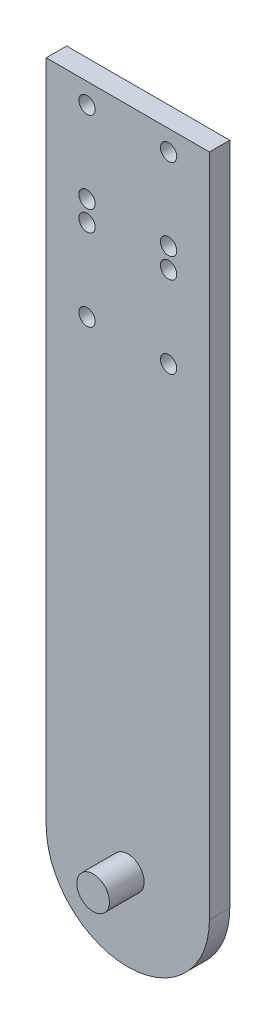
ISO-10303-21;
HEADER;
FILE_DESCRIPTION(('STEP AP214'),'2;1');
FILE_NAME('part.step','',(''),(''),'','','');
FILE_SCHEMA(('AUTOMOTIVE_DESIGN { 1 0 10303 214 1 1 1 1 }'));
ENDSEC;
DATA;
#1=APPLICATION_CONTEXT('core data for automotive mechanical design processes');
#2=APPLICATION_PROTOCOL_DEFINITION('international standard','automotive_design',2000,#1);
#3=PRODUCT_CONTEXT('',#1,'mechanical');
#4=PRODUCT('Part','Part','',(#3));
#5=PRODUCT_RELATED_PRODUCT_CATEGORY('part','',(#4));
#6=PRODUCT_DEFINITION_FORMATION('','',#4);
#7=PRODUCT_DEFINITION_CONTEXT('part definition',#1,'design');
#8=PRODUCT_DEFINITION('design','',#6,#7);
#9=PRODUCT_DEFINITION_SHAPE('','',#8);
#10=(LENGTH_UNIT() NAMED_UNIT(*) SI_UNIT(.MILLI.,.METRE.));
#11=(NAMED_UNIT(*) PLANE_ANGLE_UNIT() SI_UNIT($,.RADIAN.));
#12=(NAMED_UNIT(*) SI_UNIT($,.STERADIAN.) SOLID_ANGLE_UNIT());
#13=UNCERTAINTY_MEASURE_WITH_UNIT(LENGTH_MEASURE(1.E-05),#10,'distance_accuracy_value','');
#14=(GEOMETRIC_REPRESENTATION_CONTEXT(3) GLOBAL_UNCERTAINTY_ASSIGNED_CONTEXT((#13)) GLOBAL_UNIT_ASSIGNED_CONTEXT((#10,
#11,#12)) REPRESENTATION_CONTEXT('',''));
#15=CARTESIAN_POINT('',(0.,0.,0.));
#16=DIRECTION('',(0.,0.,1.));
#17=DIRECTION('',(1.,0.,0.));
#18=AXIS2_PLACEMENT_3D('',#15,#16,#17);
#19=CARTESIAN_POINT('',(-20.,0.,5.));
#20=DIRECTION('',(0.,0.,-1.));
#21=DIRECTION('',(-1.,0.,0.));
#22=AXIS2_PLACEMENT_3D('',#19,#20,#21);
#23=CYLINDRICAL_SURFACE('',#22,20.);
#24=CARTESIAN_POINT('',(-20.,0.,0.));
#25=DIRECTION('',(0.,0.,1.));
#26=DIRECTION('',(1.,0.,0.));
#27=AXIS2_PLACEMENT_3D('',#24,#25,#26);
#28=CIRCLE('',#27,20.);
#29=CARTESIAN_POINT('',(-40.,0.,0.));
#30=VERTEX_POINT('',#29);
#31=CARTESIAN_POINT('',(0.,0.,0.));
#32=VERTEX_POINT('',#31);
#33=EDGE_CURVE('E104',#30,#32,#28,.T.);
#34=ORIENTED_EDGE('',*,*,#33,.T.);
#35=DIRECTION('',(0.,0.,-1.));
#36=VECTOR('',#35,1.);
#37=CARTESIAN_POINT('',(0.,0.,5.));
#38=LINE('',#37,#36);
#39=CARTESIAN_POINT('',(0.,0.,5.));
#40=VERTEX_POINT('',#39);
#41=EDGE_CURVE('E11',#40,#32,#38,.T.);
#42=ORIENTED_EDGE('',*,*,#41,.F.);
#43=CARTESIAN_POINT('',(-20.,0.,5.));
#44=DIRECTION('',(0.,0.,1.));
#45=DIRECTION('',(1.,0.,0.));
#46=AXIS2_PLACEMENT_3D('',#43,#44,#45);
#47=CIRCLE('',#46,20.);
#48=CARTESIAN_POINT('',(-40.,0.,5.));
#49=VERTEX_POINT('',#48);
#50=EDGE_CURVE('E91',#49,#40,#47,.T.);
#51=ORIENTED_EDGE('',*,*,#50,.F.);
#52=DIRECTION('',(0.,0.,-1.));
#53=VECTOR('',#52,1.);
#54=CARTESIAN_POINT('',(-40.,0.,5.));
#55=LINE('',#54,#53);
#56=EDGE_CURVE('E100',#49,#30,#55,.T.);
#57=ORIENTED_EDGE('',*,*,#56,.T.);
#58=EDGE_LOOP('',(#34,#42,#51,#57));
#59=FACE_BOUND('',#58,.T.);
#60=ADVANCED_FACE('F38',(#59),#23,.T.);
#61=CARTESIAN_POINT('',(0.,0.,5.));
#62=DIRECTION('',(-1.,0.,0.));
#63=DIRECTION('',(0.,0.,1.));
#64=AXIS2_PLACEMENT_3D('',#61,#62,#63);
#65=PLANE('',#64);
#66=DIRECTION('',(0.,1.,0.));
#67=VECTOR('',#66,1.);
#68=CARTESIAN_POINT('',(0.,0.,0.));
#69=LINE('',#68,#67);
#70=CARTESIAN_POINT('',(0.,163.,0.));
#71=VERTEX_POINT('',#70);
#72=EDGE_CURVE('E95',#32,#71,#69,.T.);
#73=ORIENTED_EDGE('',*,*,#72,.T.);
#74=DIRECTION('',(0.,0.,-1.));
#75=VECTOR('',#74,1.);
#76=CARTESIAN_POINT('',(0.,163.,5.));
#77=LINE('',#76,#75);
#78=CARTESIAN_POINT('',(0.,163.,5.));
#79=VERTEX_POINT('',#78);
#80=EDGE_CURVE('E47',#79,#71,#77,.T.);
#81=ORIENTED_EDGE('',*,*,#80,.F.);
#82=DIRECTION('',(0.,1.,0.));
#83=VECTOR('',#82,1.);
#84=CARTESIAN_POINT('',(0.,0.,5.));
#85=LINE('',#84,#83);
#86=EDGE_CURVE('E86',#40,#79,#85,.T.);
#87=ORIENTED_EDGE('',*,*,#86,.F.);
#88=ORIENTED_EDGE('',*,*,#41,.T.);
#89=EDGE_LOOP('',(#73,#81,#87,#88));
#90=FACE_BOUND('',#89,.T.);
#91=ADVANCED_FACE('F94',(#90),#65,.F.);
#92=CARTESIAN_POINT('',(-40.,163.,5.));
#93=DIRECTION('',(0.,-1.,0.));
#94=DIRECTION('',(0.,0.,-1.));
#95=AXIS2_PLACEMENT_3D('',#92,#93,#94);
#96=PLANE('',#95);
#97=DIRECTION('',(-1.,0.,0.));
#98=VECTOR('',#97,1.);
#99=CARTESIAN_POINT('',(-40.,163.,0.));
#100=LINE('',#99,#98);
#101=CARTESIAN_POINT('',(-40.,163.,0.));
#102=VERTEX_POINT('',#101);
#103=EDGE_CURVE('E73',#71,#102,#100,.T.);
#104=ORIENTED_EDGE('',*,*,#103,.T.);
#105=DIRECTION('',(0.,0.,-1.));
#106=VECTOR('',#105,1.);
#107=CARTESIAN_POINT('',(-40.,163.,5.));
#108=LINE('',#107,#106);
#109=CARTESIAN_POINT('',(-40.,163.,5.));
#110=VERTEX_POINT('',#109);
#111=EDGE_CURVE('E96',#110,#102,#108,.T.);
#112=ORIENTED_EDGE('',*,*,#111,.F.);
#113=DIRECTION('',(-1.,0.,0.));
#114=VECTOR('',#113,1.);
#115=CARTESIAN_POINT('',(-40.,163.,5.));
#116=LINE('',#115,#114);
#117=EDGE_CURVE('E89',#79,#110,#116,.T.);
#118=ORIENTED_EDGE('',*,*,#117,.F.);
#119=ORIENTED_EDGE('',*,*,#80,.T.);
#120=EDGE_LOOP('',(#104,#112,#118,#119));
#121=FACE_BOUND('',#120,.T.);
#122=ADVANCED_FACE('F98',(#121),#96,.F.);
#123=CARTESIAN_POINT('',(-40.,0.,5.));
#124=DIRECTION('',(1.,0.,0.));
#125=DIRECTION('',(0.,0.,-1.));
#126=AXIS2_PLACEMENT_3D('',#123,#124,#125);
#127=PLANE('',#126);
#128=DIRECTION('',(0.,-1.,0.));
#129=VECTOR('',#128,1.);
#130=CARTESIAN_POINT('',(-40.,0.,0.));
#131=LINE('',#130,#129);
#132=EDGE_CURVE('E79',#102,#30,#131,.T.);
#133=ORIENTED_EDGE('',*,*,#132,.T.);
#134=ORIENTED_EDGE('',*,*,#56,.F.);
#135=DIRECTION('',(0.,-1.,0.));
#136=VECTOR('',#135,1.);
#137=CARTESIAN_POINT('',(-40.,0.,5.));
#138=LINE('',#137,#136);
#139=EDGE_CURVE('E56',#110,#49,#138,.T.);
#140=ORIENTED_EDGE('',*,*,#139,.F.);
#141=ORIENTED_EDGE('',*,*,#111,.T.);
#142=EDGE_LOOP('',(#133,#134,#140,#141));
#143=FACE_BOUND('',#142,.T.);
#144=ADVANCED_FACE('F163',(#143),#127,.F.);
#145=CARTESIAN_POINT('',(-20.,0.,5.));
#146=DIRECTION('',(0.,0.,1.));
#147=DIRECTION('',(1.,0.,0.));
#148=AXIS2_PLACEMENT_3D('',#145,#146,#147);
#149=PLANE('',#148);
#150=CARTESIAN_POINT('',(-10.,113.,5.));
#151=DIRECTION('',(0.,0.,1.));
#152=DIRECTION('',(1.,0.,0.));
#153=AXIS2_PLACEMENT_3D('',#150,#151,#152);
#154=CIRCLE('',#153,2.);
#155=CARTESIAN_POINT('',(-8.,113.,5.));
#156=VERTEX_POINT('',#155);
#157=EDGE_CURVE('E306',#156,#156,#154,.T.);
#158=ORIENTED_EDGE('',*,*,#157,.F.);
#159=EDGE_LOOP('',(#158));
#160=FACE_BOUND('',#159,.T.);
#161=CARTESIAN_POINT('',(-30.,113.,5.));
#162=DIRECTION('',(0.,0.,1.));
#163=DIRECTION('',(1.,0.,0.));
#164=AXIS2_PLACEMENT_3D('',#161,#162,#163);
#165=CIRCLE('',#164,2.);
#166=CARTESIAN_POINT('',(-28.,113.,5.));
#167=VERTEX_POINT('',#166);
#168=EDGE_CURVE('E310',#167,#167,#165,.T.);
#169=ORIENTED_EDGE('',*,*,#168,.F.);
#170=EDGE_LOOP('',(#169));
#171=FACE_BOUND('',#170,.T.);
#172=CARTESIAN_POINT('',(-30.,138.,5.));
#173=DIRECTION('',(0.,0.,1.));
#174=DIRECTION('',(1.,0.,0.));
#175=AXIS2_PLACEMENT_3D('',#172,#173,#174);
#176=CIRCLE('',#175,2.);
#177=CARTESIAN_POINT('',(-28.,138.,5.));
#178=VERTEX_POINT('',#177);
#179=EDGE_CURVE('E130',#178,#178,#176,.T.);
#180=ORIENTED_EDGE('',*,*,#179,.F.);
#181=EDGE_LOOP('',(#180));
#182=FACE_BOUND('',#181,.T.);
#183=CARTESIAN_POINT('',(-10.,138.,5.));
#184=DIRECTION('',(0.,0.,1.));
#185=DIRECTION('',(1.,0.,0.));
#186=AXIS2_PLACEMENT_3D('',#183,#184,#185);
#187=CIRCLE('',#186,2.);
#188=CARTESIAN_POINT('',(-8.,138.,5.));
#189=VERTEX_POINT('',#188);
#190=EDGE_CURVE('E136',#189,#189,#187,.T.);
#191=ORIENTED_EDGE('',*,*,#190,.F.);
#192=EDGE_LOOP('',(#191));
#193=FACE_BOUND('',#192,.T.);
#194=CARTESIAN_POINT('',(-30.,133.,5.));
#195=DIRECTION('',(0.,0.,1.));
#196=DIRECTION('',(1.,0.,0.));
#197=AXIS2_PLACEMENT_3D('',#194,#195,#196);
#198=CIRCLE('',#197,2.);
#199=CARTESIAN_POINT('',(-28.,133.,5.));
#200=VERTEX_POINT('',#199);
#201=EDGE_CURVE('E125',#200,#200,#198,.T.);
#202=ORIENTED_EDGE('',*,*,#201,.F.);
#203=EDGE_LOOP('',(#202));
#204=FACE_BOUND('',#203,.T.);
#205=CARTESIAN_POINT('',(-10.,133.,5.));
#206=DIRECTION('',(0.,0.,1.));
#207=DIRECTION('',(1.,0.,0.));
#208=AXIS2_PLACEMENT_3D('',#205,#206,#207);
#209=CIRCLE('',#208,2.);
#210=CARTESIAN_POINT('',(-8.,133.,5.));
#211=VERTEX_POINT('',#210);
#212=EDGE_CURVE('E134',#211,#211,#209,.T.);
#213=ORIENTED_EDGE('',*,*,#212,.F.);
#214=EDGE_LOOP('',(#213));
#215=FACE_BOUND('',#214,.T.);
#216=CARTESIAN_POINT('',(-30.,158.,5.));
#217=DIRECTION('',(0.,0.,1.));
#218=DIRECTION('',(1.,0.,0.));
#219=AXIS2_PLACEMENT_3D('',#216,#217,#218);
#220=CIRCLE('',#219,2.);
#221=CARTESIAN_POINT('',(-28.,158.,5.));
#222=VERTEX_POINT('',#221);
#223=EDGE_CURVE('E117',#222,#222,#220,.T.);
#224=ORIENTED_EDGE('',*,*,#223,.F.);
#225=EDGE_LOOP('',(#224));
#226=FACE_BOUND('',#225,.T.);
#227=CARTESIAN_POINT('',(-10.,158.,5.));
#228=DIRECTION('',(0.,0.,1.));
#229=DIRECTION('',(1.,0.,0.));
#230=AXIS2_PLACEMENT_3D('',#227,#228,#229);
#231=CIRCLE('',#230,2.);
#232=CARTESIAN_POINT('',(-8.,158.,5.));
#233=VERTEX_POINT('',#232);
#234=EDGE_CURVE('E127',#233,#233,#231,.T.);
#235=ORIENTED_EDGE('',*,*,#234,.F.);
#236=EDGE_LOOP('',(#235));
#237=FACE_BOUND('',#236,.T.);
#238=CARTESIAN_POINT('',(-20.,0.,5.));
#239=DIRECTION('',(0.,0.,1.));
#240=DIRECTION('',(1.,0.,0.));
#241=AXIS2_PLACEMENT_3D('',#238,#239,#240);
#242=CIRCLE('',#241,4.);
#243=CARTESIAN_POINT('',(-16.,0.,5.));
#244=VERTEX_POINT('',#243);
#245=EDGE_CURVE('E120',#244,#244,#242,.T.);
#246=ORIENTED_EDGE('',*,*,#245,.F.);
#247=EDGE_LOOP('',(#246));
#248=FACE_BOUND('',#247,.T.);
#249=ORIENTED_EDGE('',*,*,#50,.T.);
#250=ORIENTED_EDGE('',*,*,#86,.T.);
#251=ORIENTED_EDGE('',*,*,#117,.T.);
#252=ORIENTED_EDGE('',*,*,#139,.T.);
#253=EDGE_LOOP('',(#249,#250,#251,#252));
#254=FACE_BOUND('',#253,.T.);
#255=ADVANCED_FACE('F87',(#160,#171,#182,#193,#204,#215,#226,#237,#248,#254),#149,.T.);
#256=CARTESIAN_POINT('',(-20.,0.,0.));
#257=DIRECTION('',(0.,0.,1.));
#258=DIRECTION('',(1.,0.,0.));
#259=AXIS2_PLACEMENT_3D('',#256,#257,#258);
#260=PLANE('',#259);
#261=CARTESIAN_POINT('',(-10.,113.,0.));
#262=DIRECTION('',(0.,0.,1.));
#263=DIRECTION('',(1.,0.,0.));
#264=AXIS2_PLACEMENT_3D('',#261,#262,#263);
#265=CIRCLE('',#264,2.);
#266=CARTESIAN_POINT('',(-8.,113.,0.));
#267=VERTEX_POINT('',#266);
#268=EDGE_CURVE('E309',#267,#267,#265,.T.);
#269=ORIENTED_EDGE('',*,*,#268,.T.);
#270=EDGE_LOOP('',(#269));
#271=FACE_BOUND('',#270,.T.);
#272=CARTESIAN_POINT('',(-30.,113.,0.));
#273=DIRECTION('',(0.,0.,1.));
#274=DIRECTION('',(1.,0.,0.));
#275=AXIS2_PLACEMENT_3D('',#272,#273,#274);
#276=CIRCLE('',#275,2.);
#277=CARTESIAN_POINT('',(-28.,113.,0.));
#278=VERTEX_POINT('',#277);
#279=EDGE_CURVE('E141',#278,#278,#276,.T.);
#280=ORIENTED_EDGE('',*,*,#279,.T.);
#281=EDGE_LOOP('',(#280));
#282=FACE_BOUND('',#281,.T.);
#283=CARTESIAN_POINT('',(-30.,138.,0.));
#284=DIRECTION('',(0.,0.,1.));
#285=DIRECTION('',(1.,0.,0.));
#286=AXIS2_PLACEMENT_3D('',#283,#284,#285);
#287=CIRCLE('',#286,2.);
#288=CARTESIAN_POINT('',(-28.,138.,0.));
#289=VERTEX_POINT('',#288);
#290=EDGE_CURVE('E41',#289,#289,#287,.T.);
#291=ORIENTED_EDGE('',*,*,#290,.T.);
#292=EDGE_LOOP('',(#291));
#293=FACE_BOUND('',#292,.T.);
#294=CARTESIAN_POINT('',(-10.,138.,0.));
#295=DIRECTION('',(0.,0.,1.));
#296=DIRECTION('',(1.,0.,0.));
#297=AXIS2_PLACEMENT_3D('',#294,#295,#296);
#298=CIRCLE('',#297,2.);
#299=CARTESIAN_POINT('',(-8.,138.,0.));
#300=VERTEX_POINT('',#299);
#301=EDGE_CURVE('E128',#300,#300,#298,.T.);
#302=ORIENTED_EDGE('',*,*,#301,.T.);
#303=EDGE_LOOP('',(#302));
#304=FACE_BOUND('',#303,.T.);
#305=CARTESIAN_POINT('',(-30.,133.,0.));
#306=DIRECTION('',(0.,0.,1.));
#307=DIRECTION('',(1.,0.,0.));
#308=AXIS2_PLACEMENT_3D('',#305,#306,#307);
#309=CIRCLE('',#308,2.);
#310=CARTESIAN_POINT('',(-28.,133.,0.));
#311=VERTEX_POINT('',#310);
#312=EDGE_CURVE('E124',#311,#311,#309,.T.);
#313=ORIENTED_EDGE('',*,*,#312,.T.);
#314=EDGE_LOOP('',(#313));
#315=FACE_BOUND('',#314,.T.);
#316=CARTESIAN_POINT('',(-10.,133.,0.));
#317=DIRECTION('',(0.,0.,1.));
#318=DIRECTION('',(1.,0.,0.));
#319=AXIS2_PLACEMENT_3D('',#316,#317,#318);
#320=CIRCLE('',#319,2.);
#321=CARTESIAN_POINT('',(-8.,133.,0.));
#322=VERTEX_POINT('',#321);
#323=EDGE_CURVE('E121',#322,#322,#320,.T.);
#324=ORIENTED_EDGE('',*,*,#323,.T.);
#325=EDGE_LOOP('',(#324));
#326=FACE_BOUND('',#325,.T.);
#327=CARTESIAN_POINT('',(-30.,158.,0.));
#328=DIRECTION('',(0.,0.,1.));
#329=DIRECTION('',(1.,0.,0.));
#330=AXIS2_PLACEMENT_3D('',#327,#328,#329);
#331=CIRCLE('',#330,2.);
#332=CARTESIAN_POINT('',(-28.,158.,0.));
#333=VERTEX_POINT('',#332);
#334=EDGE_CURVE('E116',#333,#333,#331,.T.);
#335=ORIENTED_EDGE('',*,*,#334,.T.);
#336=EDGE_LOOP('',(#335));
#337=FACE_BOUND('',#336,.T.);
#338=CARTESIAN_POINT('',(-10.,158.,0.));
#339=DIRECTION('',(0.,0.,1.));
#340=DIRECTION('',(1.,0.,0.));
#341=AXIS2_PLACEMENT_3D('',#338,#339,#340);
#342=CIRCLE('',#341,2.);
#343=CARTESIAN_POINT('',(-8.,158.,0.));
#344=VERTEX_POINT('',#343);
#345=EDGE_CURVE('E113',#344,#344,#342,.T.);
#346=ORIENTED_EDGE('',*,*,#345,.T.);
#347=EDGE_LOOP('',(#346));
#348=FACE_BOUND('',#347,.T.);
#349=ORIENTED_EDGE('',*,*,#33,.F.);
#350=ORIENTED_EDGE('',*,*,#132,.F.);
#351=ORIENTED_EDGE('',*,*,#103,.F.);
#352=ORIENTED_EDGE('',*,*,#72,.F.);
#353=EDGE_LOOP('',(#349,#350,#351,#352));
#354=FACE_BOUND('',#353,.T.);
#355=ADVANCED_FACE('F162',(#271,#282,#293,#304,#315,#326,#337,#348,#354),#260,.F.);
#356=CARTESIAN_POINT('',(-20.,0.,13.5));
#357=DIRECTION('',(0.,0.,-1.));
#358=DIRECTION('',(-1.,0.,0.));
#359=AXIS2_PLACEMENT_3D('',#356,#357,#358);
#360=CYLINDRICAL_SURFACE('',#359,4.);
#361=CARTESIAN_POINT('',(-20.,0.,13.5));
#362=DIRECTION('',(0.,0.,1.));
#363=DIRECTION('',(1.,0.,0.));
#364=AXIS2_PLACEMENT_3D('',#361,#362,#363);
#365=CIRCLE('',#364,4.);
#366=CARTESIAN_POINT('',(-16.,0.,13.5));
#367=VERTEX_POINT('',#366);
#368=EDGE_CURVE('E107',#367,#367,#365,.T.);
#369=ORIENTED_EDGE('',*,*,#368,.F.);
#370=EDGE_LOOP('',(#369));
#371=FACE_BOUND('',#370,.T.);
#372=ORIENTED_EDGE('',*,*,#245,.T.);
#373=EDGE_LOOP('',(#372));
#374=FACE_BOUND('',#373,.T.);
#375=ADVANCED_FACE('F159',(#371,#374),#360,.T.);
#376=CARTESIAN_POINT('',(-20.,0.,13.5));
#377=DIRECTION('',(0.,0.,1.));
#378=DIRECTION('',(1.,0.,0.));
#379=AXIS2_PLACEMENT_3D('',#376,#377,#378);
#380=PLANE('',#379);
#381=ORIENTED_EDGE('',*,*,#368,.T.);
#382=EDGE_LOOP('',(#381));
#383=FACE_BOUND('',#382,.T.);
#384=ADVANCED_FACE('F203',(#383),#380,.T.);
#385=CARTESIAN_POINT('',(-10.,158.,-45.));
#386=DIRECTION('',(0.,0.,1.));
#387=DIRECTION('',(1.,0.,0.));
#388=AXIS2_PLACEMENT_3D('',#385,#386,#387);
#389=CYLINDRICAL_SURFACE('',#388,2.);
#390=ORIENTED_EDGE('',*,*,#234,.T.);
#391=EDGE_LOOP('',(#390));
#392=FACE_BOUND('',#391,.T.);
#393=ORIENTED_EDGE('',*,*,#345,.F.);
#394=EDGE_LOOP('',(#393));
#395=FACE_BOUND('',#394,.T.);
#396=ADVANCED_FACE('F213',(#392,#395),#389,.F.);
#397=CARTESIAN_POINT('',(-30.,158.,-45.));
#398=DIRECTION('',(0.,0.,1.));
#399=DIRECTION('',(1.,0.,0.));
#400=AXIS2_PLACEMENT_3D('',#397,#398,#399);
#401=CYLINDRICAL_SURFACE('',#400,2.);
#402=ORIENTED_EDGE('',*,*,#223,.T.);
#403=EDGE_LOOP('',(#402));
#404=FACE_BOUND('',#403,.T.);
#405=ORIENTED_EDGE('',*,*,#334,.F.);
#406=EDGE_LOOP('',(#405));
#407=FACE_BOUND('',#406,.T.);
#408=ADVANCED_FACE('F223',(#404,#407),#401,.F.);
#409=CARTESIAN_POINT('',(-10.,133.,-45.));
#410=DIRECTION('',(0.,0.,1.));
#411=DIRECTION('',(1.,0.,0.));
#412=AXIS2_PLACEMENT_3D('',#409,#410,#411);
#413=CYLINDRICAL_SURFACE('',#412,2.);
#414=ORIENTED_EDGE('',*,*,#212,.T.);
#415=EDGE_LOOP('',(#414));
#416=FACE_BOUND('',#415,.T.);
#417=ORIENTED_EDGE('',*,*,#323,.F.);
#418=EDGE_LOOP('',(#417));
#419=FACE_BOUND('',#418,.T.);
#420=ADVANCED_FACE('F233',(#416,#419),#413,.F.);
#421=CARTESIAN_POINT('',(-30.,133.,-45.));
#422=DIRECTION('',(0.,0.,1.));
#423=DIRECTION('',(1.,0.,0.));
#424=AXIS2_PLACEMENT_3D('',#421,#422,#423);
#425=CYLINDRICAL_SURFACE('',#424,2.);
#426=ORIENTED_EDGE('',*,*,#201,.T.);
#427=EDGE_LOOP('',(#426));
#428=FACE_BOUND('',#427,.T.);
#429=ORIENTED_EDGE('',*,*,#312,.F.);
#430=EDGE_LOOP('',(#429));
#431=FACE_BOUND('',#430,.T.);
#432=ADVANCED_FACE('F243',(#428,#431),#425,.F.);
#433=CARTESIAN_POINT('',(-10.,138.,-45.));
#434=DIRECTION('',(0.,0.,1.));
#435=DIRECTION('',(1.,0.,0.));
#436=AXIS2_PLACEMENT_3D('',#433,#434,#435);
#437=CYLINDRICAL_SURFACE('',#436,2.);
#438=ORIENTED_EDGE('',*,*,#190,.T.);
#439=EDGE_LOOP('',(#438));
#440=FACE_BOUND('',#439,.T.);
#441=ORIENTED_EDGE('',*,*,#301,.F.);
#442=EDGE_LOOP('',(#441));
#443=FACE_BOUND('',#442,.T.);
#444=ADVANCED_FACE('F252',(#440,#443),#437,.F.);
#445=CARTESIAN_POINT('',(-30.,138.,-45.));
#446=DIRECTION('',(0.,0.,1.));
#447=DIRECTION('',(1.,0.,0.));
#448=AXIS2_PLACEMENT_3D('',#445,#446,#447);
#449=CYLINDRICAL_SURFACE('',#448,2.);
#450=ORIENTED_EDGE('',*,*,#179,.T.);
#451=EDGE_LOOP('',(#450));
#452=FACE_BOUND('',#451,.T.);
#453=ORIENTED_EDGE('',*,*,#290,.F.);
#454=EDGE_LOOP('',(#453));
#455=FACE_BOUND('',#454,.T.);
#456=ADVANCED_FACE('F271',(#452,#455),#449,.F.);
#457=CARTESIAN_POINT('',(-30.,113.,-45.));
#458=DIRECTION('',(0.,0.,1.));
#459=DIRECTION('',(1.,0.,0.));
#460=AXIS2_PLACEMENT_3D('',#457,#458,#459);
#461=CYLINDRICAL_SURFACE('',#460,2.);
#462=ORIENTED_EDGE('',*,*,#168,.T.);
#463=EDGE_LOOP('',(#462));
#464=FACE_BOUND('',#463,.T.);
#465=ORIENTED_EDGE('',*,*,#279,.F.);
#466=EDGE_LOOP('',(#465));
#467=FACE_BOUND('',#466,.T.);
#468=ADVANCED_FACE('F281',(#464,#467),#461,.F.);
#469=CARTESIAN_POINT('',(-10.,113.,-45.));
#470=DIRECTION('',(0.,0.,1.));
#471=DIRECTION('',(1.,0.,0.));
#472=AXIS2_PLACEMENT_3D('',#469,#470,#471);
#473=CYLINDRICAL_SURFACE('',#472,2.);
#474=ORIENTED_EDGE('',*,*,#157,.T.);
#475=EDGE_LOOP('',(#474));
#476=FACE_BOUND('',#475,.T.);
#477=ORIENTED_EDGE('',*,*,#268,.F.);
#478=EDGE_LOOP('',(#477));
#479=FACE_BOUND('',#478,.T.);
#480=ADVANCED_FACE('F290',(#476,#479),#473,.F.);
#481=CLOSED_SHELL('',(#60,#91,#122,#144,#255,#355,#375,#384,#396,#408,#420,#432,#444,#456,#468,#480));
#482=MANIFOLD_SOLID_BREP('B2',#481);
#483=ADVANCED_BREP_SHAPE_REPRESENTATION('',(#18,#482),#14);
#484=SHAPE_DEFINITION_REPRESENTATION(#9,#483);
ENDSEC;
END-ISO-10303-21;
